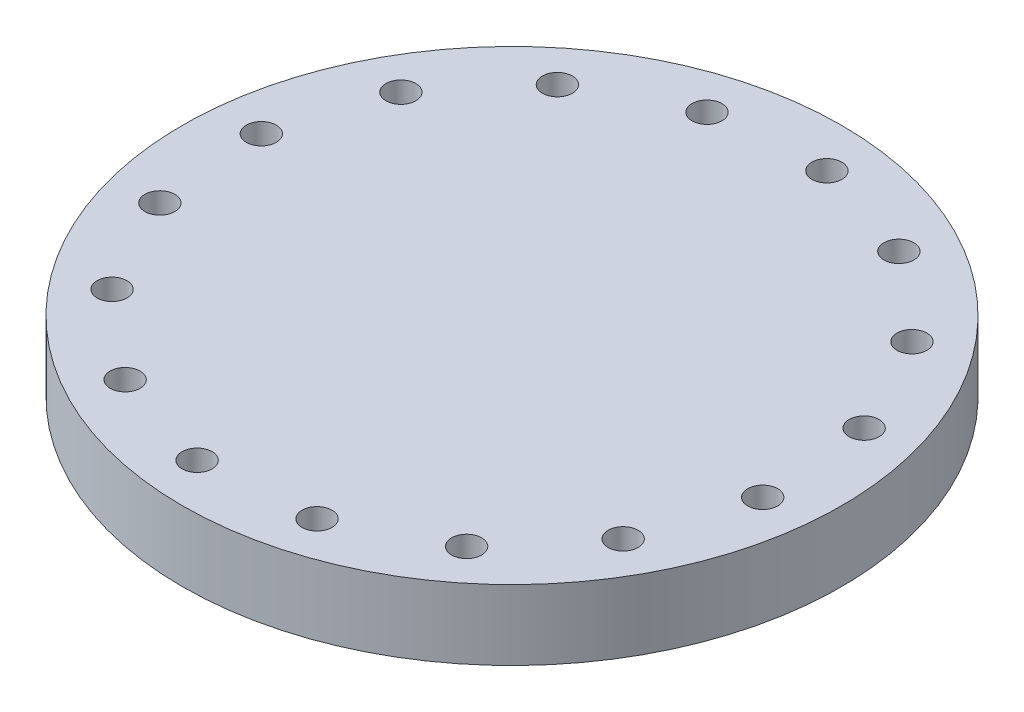
ISO-10303-21;
HEADER;
FILE_DESCRIPTION(('STEP AP214'),'2;1');
FILE_NAME('part.step','',(''),(''),'','','');
FILE_SCHEMA(('AUTOMOTIVE_DESIGN { 1 0 10303 214 1 1 1 1 }'));
ENDSEC;
DATA;
#1=APPLICATION_CONTEXT('core data for automotive mechanical design processes');
#2=APPLICATION_PROTOCOL_DEFINITION('international standard','automotive_design',2000,#1);
#3=PRODUCT_CONTEXT('',#1,'mechanical');
#4=PRODUCT('Part','Part','',(#3));
#5=PRODUCT_RELATED_PRODUCT_CATEGORY('part','',(#4));
#6=PRODUCT_DEFINITION_FORMATION('','',#4);
#7=PRODUCT_DEFINITION_CONTEXT('part definition',#1,'design');
#8=PRODUCT_DEFINITION('design','',#6,#7);
#9=PRODUCT_DEFINITION_SHAPE('','',#8);
#10=(LENGTH_UNIT() NAMED_UNIT(*) SI_UNIT(.MILLI.,.METRE.));
#11=(NAMED_UNIT(*) PLANE_ANGLE_UNIT() SI_UNIT($,.RADIAN.));
#12=(NAMED_UNIT(*) SI_UNIT($,.STERADIAN.) SOLID_ANGLE_UNIT());
#13=UNCERTAINTY_MEASURE_WITH_UNIT(LENGTH_MEASURE(1.E-05),#10,'distance_accuracy_value','');
#14=(GEOMETRIC_REPRESENTATION_CONTEXT(3) GLOBAL_UNCERTAINTY_ASSIGNED_CONTEXT((#13)) GLOBAL_UNIT_ASSIGNED_CONTEXT((#10,
#11,#12)) REPRESENTATION_CONTEXT('',''));
#15=CARTESIAN_POINT('',(0.,0.,0.));
#16=DIRECTION('',(0.,0.,1.));
#17=DIRECTION('',(1.,0.,0.));
#18=AXIS2_PLACEMENT_3D('',#15,#16,#17);
#19=CARTESIAN_POINT('',(0.,2.925,0.));
#20=DIRECTION('',(0.,-1.,0.));
#21=DIRECTION('',(0.,0.,-1.));
#22=AXIS2_PLACEMENT_3D('',#19,#20,#21);
#23=CYLINDRICAL_SURFACE('',#22,27.5);
#24=CARTESIAN_POINT('',(0.,2.925,0.));
#25=DIRECTION('',(0.,1.,0.));
#26=DIRECTION('',(0.,0.,1.));
#27=AXIS2_PLACEMENT_3D('',#24,#25,#26);
#28=CIRCLE('',#27,27.5);
#29=CARTESIAN_POINT('',(0.,2.925,27.5));
#30=VERTEX_POINT('',#29);
#31=EDGE_CURVE('E10',#30,#30,#28,.T.);
#32=ORIENTED_EDGE('',*,*,#31,.F.);
#33=EDGE_LOOP('',(#32));
#34=FACE_BOUND('',#33,.T.);
#35=CARTESIAN_POINT('',(0.,-2.925,0.));
#36=DIRECTION('',(0.,1.,0.));
#37=DIRECTION('',(0.,0.,1.));
#38=AXIS2_PLACEMENT_3D('',#35,#36,#37);
#39=CIRCLE('',#38,27.5);
#40=CARTESIAN_POINT('',(0.,-2.925,27.5));
#41=VERTEX_POINT('',#40);
#42=EDGE_CURVE('E40',#41,#41,#39,.T.);
#43=ORIENTED_EDGE('',*,*,#42,.T.);
#44=EDGE_LOOP('',(#43));
#45=FACE_BOUND('',#44,.T.);
#46=ADVANCED_FACE('F37',(#34,#45),#23,.T.);
#47=CARTESIAN_POINT('',(0.,2.925,0.));
#48=DIRECTION('',(0.,1.,0.));
#49=DIRECTION('',(0.,0.,1.));
#50=AXIS2_PLACEMENT_3D('',#47,#48,#49);
#51=PLANE('',#50);
#52=CARTESIAN_POINT('',(6.5570380805478,2.925,22.8269084987493));
#53=DIRECTION('',(0.,-1.,0.));
#54=DIRECTION('',(0.,0.,-1.));
#55=AXIS2_PLACEMENT_3D('',#52,#53,#54);
#56=CIRCLE('',#55,1.25);
#57=CARTESIAN_POINT('',(6.5570380805478,2.925,21.5769084987493));
#58=VERTEX_POINT('',#57);
#59=EDGE_CURVE('E62',#58,#58,#56,.T.);
#60=ORIENTED_EDGE('',*,*,#59,.T.);
#61=EDGE_LOOP('',(#60));
#62=FACE_BOUND('',#61,.T.);
#63=CARTESIAN_POINT('',(20.7775878842444,2.925,11.5045357017376));
#64=DIRECTION('',(0.,-1.,0.));
#65=DIRECTION('',(0.,0.,-1.));
#66=AXIS2_PLACEMENT_3D('',#63,#64,#65);
#67=CIRCLE('',#66,1.25);
#68=CARTESIAN_POINT('',(20.7775878842444,2.925,10.2545357017376));
#69=VERTEX_POINT('',#68);
#70=EDGE_CURVE('E55',#69,#69,#67,.T.);
#71=ORIENTED_EDGE('',*,*,#70,.T.);
#72=EDGE_LOOP('',(#71));
#73=FACE_BOUND('',#72,.T.);
#74=CARTESIAN_POINT('',(14.7933929711003,2.925,18.5800437136904));
#75=DIRECTION('',(0.,-1.,0.));
#76=DIRECTION('',(0.,0.,-1.));
#77=AXIS2_PLACEMENT_3D('',#74,#75,#76);
#78=CIRCLE('',#77,1.25);
#79=CARTESIAN_POINT('',(14.7933929711003,2.925,17.3300437136904));
#80=VERTEX_POINT('',#79);
#81=EDGE_CURVE('E69',#80,#80,#78,.T.);
#82=ORIENTED_EDGE('',*,*,#81,.T.);
#83=EDGE_LOOP('',(#82));
#84=FACE_BOUND('',#83,.T.);
#85=CARTESIAN_POINT('',(-2.67756641806983,2.925,23.5985833913147));
#86=DIRECTION('',(0.,-1.,0.));
#87=DIRECTION('',(0.,0.,-1.));
#88=AXIS2_PLACEMENT_3D('',#85,#86,#87);
#89=CIRCLE('',#88,1.25);
#90=CARTESIAN_POINT('',(-2.67756641806983,2.925,22.3485833913147));
#91=VERTEX_POINT('',#90);
#92=EDGE_CURVE('E68',#91,#91,#89,.T.);
#93=ORIENTED_EDGE('',*,*,#92,.T.);
#94=EDGE_LOOP('',(#93));
#95=FACE_BOUND('',#94,.T.);
#96=CARTESIAN_POINT('',(-11.5045357017362,2.925,20.7775878842435));
#97=DIRECTION('',(0.,-1.,0.));
#98=DIRECTION('',(0.,0.,-1.));
#99=AXIS2_PLACEMENT_3D('',#96,#97,#98);
#100=CIRCLE('',#99,1.24999999999997);
#101=CARTESIAN_POINT('',(-11.5045357017362,2.925,19.5275878842435));
#102=VERTEX_POINT('',#101);
#103=EDGE_CURVE('E79',#102,#102,#100,.T.);
#104=ORIENTED_EDGE('',*,*,#103,.T.);
#105=EDGE_LOOP('',(#104));
#106=FACE_BOUND('',#105,.T.);
#107=CARTESIAN_POINT('',(-18.5800437136888,2.925,14.7933929710995));
#108=DIRECTION('',(0.,-1.,0.));
#109=DIRECTION('',(0.,0.,-1.));
#110=AXIS2_PLACEMENT_3D('',#107,#108,#109);
#111=CIRCLE('',#110,1.25);
#112=CARTESIAN_POINT('',(-18.5800437136888,2.925,13.5433929710995));
#113=VERTEX_POINT('',#112);
#114=EDGE_CURVE('E85',#113,#113,#111,.T.);
#115=ORIENTED_EDGE('',*,*,#114,.T.);
#116=EDGE_LOOP('',(#115));
#117=FACE_BOUND('',#116,.T.);
#118=CARTESIAN_POINT('',(-22.8269084987479,2.925,6.5570380805468));
#119=DIRECTION('',(0.,-1.,0.));
#120=DIRECTION('',(0.,0.,-1.));
#121=AXIS2_PLACEMENT_3D('',#118,#119,#120);
#122=CIRCLE('',#121,1.25000000000003);
#123=CARTESIAN_POINT('',(-22.8269084987479,2.925,5.30703808054678));
#124=VERTEX_POINT('',#123);
#125=EDGE_CURVE('E91',#124,#124,#122,.T.);
#126=ORIENTED_EDGE('',*,*,#125,.T.);
#127=EDGE_LOOP('',(#126));
#128=FACE_BOUND('',#127,.T.);
#129=CARTESIAN_POINT('',(-23.5985833913132,2.925,-2.67756641807084));
#130=DIRECTION('',(0.,-1.,0.));
#131=DIRECTION('',(0.,0.,-1.));
#132=AXIS2_PLACEMENT_3D('',#129,#130,#131);
#133=CIRCLE('',#132,1.25);
#134=CARTESIAN_POINT('',(-23.5985833913132,2.925,-3.92756641807084));
#135=VERTEX_POINT('',#134);
#136=EDGE_CURVE('E97',#135,#135,#133,.T.);
#137=ORIENTED_EDGE('',*,*,#136,.T.);
#138=EDGE_LOOP('',(#137));
#139=FACE_BOUND('',#138,.T.);
#140=CARTESIAN_POINT('',(-20.777587884242,2.925,-11.5045357017372));
#141=DIRECTION('',(0.,-1.,0.));
#142=DIRECTION('',(0.,0.,-1.));
#143=AXIS2_PLACEMENT_3D('',#140,#141,#142);
#144=CIRCLE('',#143,1.25);
#145=CARTESIAN_POINT('',(-20.777587884242,2.925,-12.7545357017372));
#146=VERTEX_POINT('',#145);
#147=EDGE_CURVE('E103',#146,#146,#144,.T.);
#148=ORIENTED_EDGE('',*,*,#147,.T.);
#149=EDGE_LOOP('',(#148));
#150=FACE_BOUND('',#149,.T.);
#151=CARTESIAN_POINT('',(-14.7933929710979,2.925,-18.5800437136898));
#152=DIRECTION('',(0.,-1.,0.));
#153=DIRECTION('',(0.,0.,-1.));
#154=AXIS2_PLACEMENT_3D('',#151,#152,#153);
#155=CIRCLE('',#154,1.25);
#156=CARTESIAN_POINT('',(-14.7933929710979,2.925,-19.8300437136898));
#157=VERTEX_POINT('',#156);
#158=EDGE_CURVE('E109',#157,#157,#155,.T.);
#159=ORIENTED_EDGE('',*,*,#158,.T.);
#160=EDGE_LOOP('',(#159));
#161=FACE_BOUND('',#160,.T.);
#162=CARTESIAN_POINT('',(-6.5570380805456,2.925,-22.8269084987487));
#163=DIRECTION('',(0.,-1.,0.));
#164=DIRECTION('',(0.,0.,-1.));
#165=AXIS2_PLACEMENT_3D('',#162,#163,#164);
#166=CIRCLE('',#165,1.25);
#167=CARTESIAN_POINT('',(-6.5570380805456,2.925,-24.0769084987487));
#168=VERTEX_POINT('',#167);
#169=EDGE_CURVE('E115',#168,#168,#166,.T.);
#170=ORIENTED_EDGE('',*,*,#169,.T.);
#171=EDGE_LOOP('',(#170));
#172=FACE_BOUND('',#171,.T.);
#173=CARTESIAN_POINT('',(2.67756641807205,2.925,-23.5985833913141));
#174=DIRECTION('',(0.,-1.,0.));
#175=DIRECTION('',(0.,0.,-1.));
#176=AXIS2_PLACEMENT_3D('',#173,#174,#175);
#177=CIRCLE('',#176,1.25);
#178=CARTESIAN_POINT('',(2.67756641807205,2.925,-24.8485833913141));
#179=VERTEX_POINT('',#178);
#180=EDGE_CURVE('E121',#179,#179,#177,.T.);
#181=ORIENTED_EDGE('',*,*,#180,.T.);
#182=EDGE_LOOP('',(#181));
#183=FACE_BOUND('',#182,.T.);
#184=CARTESIAN_POINT('',(11.5045357017384,2.925,-20.777587884243));
#185=DIRECTION('',(0.,-1.,0.));
#186=DIRECTION('',(0.,0.,-1.));
#187=AXIS2_PLACEMENT_3D('',#184,#185,#186);
#188=CIRCLE('',#187,1.25);
#189=CARTESIAN_POINT('',(11.5045357017384,2.925,-22.027587884243));
#190=VERTEX_POINT('',#189);
#191=EDGE_CURVE('E127',#190,#190,#188,.T.);
#192=ORIENTED_EDGE('',*,*,#191,.T.);
#193=EDGE_LOOP('',(#192));
#194=FACE_BOUND('',#193,.T.);
#195=CARTESIAN_POINT('',(18.5800437136911,2.925,-14.7933929710991));
#196=DIRECTION('',(0.,-1.,0.));
#197=DIRECTION('',(0.,0.,-1.));
#198=AXIS2_PLACEMENT_3D('',#195,#196,#197);
#199=CIRCLE('',#198,1.25);
#200=CARTESIAN_POINT('',(18.5800437136911,2.925,-16.0433929710991));
#201=VERTEX_POINT('',#200);
#202=EDGE_CURVE('E133',#201,#201,#199,.T.);
#203=ORIENTED_EDGE('',*,*,#202,.T.);
#204=EDGE_LOOP('',(#203));
#205=FACE_BOUND('',#204,.T.);
#206=CARTESIAN_POINT('',(23.5985833913156,2.925,2.67756641807121));
#207=DIRECTION('',(0.,-1.,0.));
#208=DIRECTION('',(0.,0.,-1.));
#209=AXIS2_PLACEMENT_3D('',#206,#207,#208);
#210=CIRCLE('',#209,1.24999999999999);
#211=CARTESIAN_POINT('',(23.5985833913156,2.925,1.42756641807122));
#212=VERTEX_POINT('',#211);
#213=EDGE_CURVE('E139',#212,#212,#210,.T.);
#214=ORIENTED_EDGE('',*,*,#213,.T.);
#215=EDGE_LOOP('',(#214));
#216=FACE_BOUND('',#215,.T.);
#217=CARTESIAN_POINT('',(22.8269084987502,2.925,-6.55703808054647));
#218=DIRECTION('',(0.,-1.,0.));
#219=DIRECTION('',(0.,0.,-1.));
#220=AXIS2_PLACEMENT_3D('',#217,#218,#219);
#221=CIRCLE('',#220,1.25000000000003);
#222=CARTESIAN_POINT('',(22.8269084987502,2.925,-7.80703808054649));
#223=VERTEX_POINT('',#222);
#224=EDGE_CURVE('E47',#223,#223,#221,.T.);
#225=ORIENTED_EDGE('',*,*,#224,.T.);
#226=EDGE_LOOP('',(#225));
#227=FACE_BOUND('',#226,.T.);
#228=ORIENTED_EDGE('',*,*,#31,.T.);
#229=EDGE_LOOP('',(#228));
#230=FACE_BOUND('',#229,.T.);
#231=ADVANCED_FACE('F152',(#62,#73,#84,#95,#106,#117,#128,#139,#150,#161,#172,#183,#194,#205,
#216,#227,#230),#51,.T.);
#232=CARTESIAN_POINT('',(0.,-2.925,0.));
#233=DIRECTION('',(0.,1.,0.));
#234=DIRECTION('',(0.,0.,1.));
#235=AXIS2_PLACEMENT_3D('',#232,#233,#234);
#236=PLANE('',#235);
#237=CARTESIAN_POINT('',(6.5570380805478,-2.925,22.8269084987493));
#238=DIRECTION('',(0.,-1.,0.));
#239=DIRECTION('',(0.,0.,-1.));
#240=AXIS2_PLACEMENT_3D('',#237,#238,#239);
#241=CIRCLE('',#240,1.25);
#242=CARTESIAN_POINT('',(6.5570380805478,-2.925,21.5769084987493));
#243=VERTEX_POINT('',#242);
#244=EDGE_CURVE('E65',#243,#243,#241,.T.);
#245=ORIENTED_EDGE('',*,*,#244,.F.);
#246=EDGE_LOOP('',(#245));
#247=FACE_BOUND('',#246,.T.);
#248=CARTESIAN_POINT('',(20.7775878842444,-2.925,11.5045357017376));
#249=DIRECTION('',(0.,-1.,0.));
#250=DIRECTION('',(0.,0.,-1.));
#251=AXIS2_PLACEMENT_3D('',#248,#249,#250);
#252=CIRCLE('',#251,1.25);
#253=CARTESIAN_POINT('',(20.7775878842444,-2.925,10.2545357017376));
#254=VERTEX_POINT('',#253);
#255=EDGE_CURVE('E58',#254,#254,#252,.T.);
#256=ORIENTED_EDGE('',*,*,#255,.F.);
#257=EDGE_LOOP('',(#256));
#258=FACE_BOUND('',#257,.T.);
#259=CARTESIAN_POINT('',(14.7933929711003,-2.925,18.5800437136904));
#260=DIRECTION('',(0.,-1.,0.));
#261=DIRECTION('',(0.,0.,-1.));
#262=AXIS2_PLACEMENT_3D('',#259,#260,#261);
#263=CIRCLE('',#262,1.25);
#264=CARTESIAN_POINT('',(14.7933929711003,-2.925,17.3300437136904));
#265=VERTEX_POINT('',#264);
#266=EDGE_CURVE('E59',#265,#265,#263,.T.);
#267=ORIENTED_EDGE('',*,*,#266,.F.);
#268=EDGE_LOOP('',(#267));
#269=FACE_BOUND('',#268,.T.);
#270=CARTESIAN_POINT('',(-2.67756641806983,-2.925,23.5985833913147));
#271=DIRECTION('',(0.,-1.,0.));
#272=DIRECTION('',(0.,0.,-1.));
#273=AXIS2_PLACEMENT_3D('',#270,#271,#272);
#274=CIRCLE('',#273,1.25);
#275=CARTESIAN_POINT('',(-2.67756641806983,-2.925,22.3485833913147));
#276=VERTEX_POINT('',#275);
#277=EDGE_CURVE('E76',#276,#276,#274,.T.);
#278=ORIENTED_EDGE('',*,*,#277,.F.);
#279=EDGE_LOOP('',(#278));
#280=FACE_BOUND('',#279,.T.);
#281=CARTESIAN_POINT('',(-11.5045357017362,-2.925,20.7775878842435));
#282=DIRECTION('',(0.,-1.,0.));
#283=DIRECTION('',(0.,0.,-1.));
#284=AXIS2_PLACEMENT_3D('',#281,#282,#283);
#285=CIRCLE('',#284,1.24999999999997);
#286=CARTESIAN_POINT('',(-11.5045357017362,-2.925,19.5275878842435));
#287=VERTEX_POINT('',#286);
#288=EDGE_CURVE('E82',#287,#287,#285,.T.);
#289=ORIENTED_EDGE('',*,*,#288,.F.);
#290=EDGE_LOOP('',(#289));
#291=FACE_BOUND('',#290,.T.);
#292=CARTESIAN_POINT('',(-18.5800437136888,-2.925,14.7933929710995));
#293=DIRECTION('',(0.,-1.,0.));
#294=DIRECTION('',(0.,0.,-1.));
#295=AXIS2_PLACEMENT_3D('',#292,#293,#294);
#296=CIRCLE('',#295,1.25);
#297=CARTESIAN_POINT('',(-18.5800437136888,-2.925,13.5433929710995));
#298=VERTEX_POINT('',#297);
#299=EDGE_CURVE('E88',#298,#298,#296,.T.);
#300=ORIENTED_EDGE('',*,*,#299,.F.);
#301=EDGE_LOOP('',(#300));
#302=FACE_BOUND('',#301,.T.);
#303=CARTESIAN_POINT('',(-22.8269084987479,-2.925,6.5570380805468));
#304=DIRECTION('',(0.,-1.,0.));
#305=DIRECTION('',(0.,0.,-1.));
#306=AXIS2_PLACEMENT_3D('',#303,#304,#305);
#307=CIRCLE('',#306,1.25000000000003);
#308=CARTESIAN_POINT('',(-22.8269084987479,-2.925,5.30703808054678));
#309=VERTEX_POINT('',#308);
#310=EDGE_CURVE('E94',#309,#309,#307,.T.);
#311=ORIENTED_EDGE('',*,*,#310,.F.);
#312=EDGE_LOOP('',(#311));
#313=FACE_BOUND('',#312,.T.);
#314=CARTESIAN_POINT('',(-23.5985833913132,-2.925,-2.67756641807084));
#315=DIRECTION('',(0.,-1.,0.));
#316=DIRECTION('',(0.,0.,-1.));
#317=AXIS2_PLACEMENT_3D('',#314,#315,#316);
#318=CIRCLE('',#317,1.25);
#319=CARTESIAN_POINT('',(-23.5985833913132,-2.925,-3.92756641807084));
#320=VERTEX_POINT('',#319);
#321=EDGE_CURVE('E100',#320,#320,#318,.T.);
#322=ORIENTED_EDGE('',*,*,#321,.F.);
#323=EDGE_LOOP('',(#322));
#324=FACE_BOUND('',#323,.T.);
#325=CARTESIAN_POINT('',(-20.777587884242,-2.925,-11.5045357017372));
#326=DIRECTION('',(0.,-1.,0.));
#327=DIRECTION('',(0.,0.,-1.));
#328=AXIS2_PLACEMENT_3D('',#325,#326,#327);
#329=CIRCLE('',#328,1.25);
#330=CARTESIAN_POINT('',(-20.777587884242,-2.925,-12.7545357017372));
#331=VERTEX_POINT('',#330);
#332=EDGE_CURVE('E106',#331,#331,#329,.T.);
#333=ORIENTED_EDGE('',*,*,#332,.F.);
#334=EDGE_LOOP('',(#333));
#335=FACE_BOUND('',#334,.T.);
#336=CARTESIAN_POINT('',(-14.7933929710979,-2.925,-18.5800437136898));
#337=DIRECTION('',(0.,-1.,0.));
#338=DIRECTION('',(0.,0.,-1.));
#339=AXIS2_PLACEMENT_3D('',#336,#337,#338);
#340=CIRCLE('',#339,1.25);
#341=CARTESIAN_POINT('',(-14.7933929710979,-2.925,-19.8300437136898));
#342=VERTEX_POINT('',#341);
#343=EDGE_CURVE('E112',#342,#342,#340,.T.);
#344=ORIENTED_EDGE('',*,*,#343,.F.);
#345=EDGE_LOOP('',(#344));
#346=FACE_BOUND('',#345,.T.);
#347=CARTESIAN_POINT('',(-6.5570380805456,-2.925,-22.8269084987487));
#348=DIRECTION('',(0.,-1.,0.));
#349=DIRECTION('',(0.,0.,-1.));
#350=AXIS2_PLACEMENT_3D('',#347,#348,#349);
#351=CIRCLE('',#350,1.25);
#352=CARTESIAN_POINT('',(-6.5570380805456,-2.925,-24.0769084987487));
#353=VERTEX_POINT('',#352);
#354=EDGE_CURVE('E118',#353,#353,#351,.T.);
#355=ORIENTED_EDGE('',*,*,#354,.F.);
#356=EDGE_LOOP('',(#355));
#357=FACE_BOUND('',#356,.T.);
#358=CARTESIAN_POINT('',(2.67756641807205,-2.925,-23.5985833913141));
#359=DIRECTION('',(0.,-1.,0.));
#360=DIRECTION('',(0.,0.,-1.));
#361=AXIS2_PLACEMENT_3D('',#358,#359,#360);
#362=CIRCLE('',#361,1.25);
#363=CARTESIAN_POINT('',(2.67756641807205,-2.925,-24.8485833913141));
#364=VERTEX_POINT('',#363);
#365=EDGE_CURVE('E124',#364,#364,#362,.T.);
#366=ORIENTED_EDGE('',*,*,#365,.F.);
#367=EDGE_LOOP('',(#366));
#368=FACE_BOUND('',#367,.T.);
#369=CARTESIAN_POINT('',(11.5045357017384,-2.925,-20.777587884243));
#370=DIRECTION('',(0.,-1.,0.));
#371=DIRECTION('',(0.,0.,-1.));
#372=AXIS2_PLACEMENT_3D('',#369,#370,#371);
#373=CIRCLE('',#372,1.25);
#374=CARTESIAN_POINT('',(11.5045357017384,-2.925,-22.027587884243));
#375=VERTEX_POINT('',#374);
#376=EDGE_CURVE('E130',#375,#375,#373,.T.);
#377=ORIENTED_EDGE('',*,*,#376,.F.);
#378=EDGE_LOOP('',(#377));
#379=FACE_BOUND('',#378,.T.);
#380=CARTESIAN_POINT('',(18.5800437136911,-2.925,-14.7933929710991));
#381=DIRECTION('',(0.,-1.,0.));
#382=DIRECTION('',(0.,0.,-1.));
#383=AXIS2_PLACEMENT_3D('',#380,#381,#382);
#384=CIRCLE('',#383,1.25);
#385=CARTESIAN_POINT('',(18.5800437136911,-2.925,-16.0433929710991));
#386=VERTEX_POINT('',#385);
#387=EDGE_CURVE('E136',#386,#386,#384,.T.);
#388=ORIENTED_EDGE('',*,*,#387,.F.);
#389=EDGE_LOOP('',(#388));
#390=FACE_BOUND('',#389,.T.);
#391=CARTESIAN_POINT('',(23.5985833913156,-2.925,2.67756641807121));
#392=DIRECTION('',(0.,-1.,0.));
#393=DIRECTION('',(0.,0.,-1.));
#394=AXIS2_PLACEMENT_3D('',#391,#392,#393);
#395=CIRCLE('',#394,1.24999999999999);
#396=CARTESIAN_POINT('',(23.5985833913156,-2.925,1.42756641807122));
#397=VERTEX_POINT('',#396);
#398=EDGE_CURVE('E52',#397,#397,#395,.T.);
#399=ORIENTED_EDGE('',*,*,#398,.F.);
#400=EDGE_LOOP('',(#399));
#401=FACE_BOUND('',#400,.T.);
#402=CARTESIAN_POINT('',(22.8269084987502,-2.925,-6.55703808054647));
#403=DIRECTION('',(0.,-1.,0.));
#404=DIRECTION('',(0.,0.,-1.));
#405=AXIS2_PLACEMENT_3D('',#402,#403,#404);
#406=CIRCLE('',#405,1.25000000000003);
#407=CARTESIAN_POINT('',(22.8269084987502,-2.925,-7.80703808054649));
#408=VERTEX_POINT('',#407);
#409=EDGE_CURVE('E49',#408,#408,#406,.T.);
#410=ORIENTED_EDGE('',*,*,#409,.F.);
#411=EDGE_LOOP('',(#410));
#412=FACE_BOUND('',#411,.T.);
#413=ORIENTED_EDGE('',*,*,#42,.F.);
#414=EDGE_LOOP('',(#413));
#415=FACE_BOUND('',#414,.T.);
#416=ADVANCED_FACE('F148',(#247,#258,#269,#280,#291,#302,#313,#324,#335,#346,#357,#368,#379,
#390,#401,#412,#415),#236,.F.);
#417=CARTESIAN_POINT('',(22.8269084987502,2.925,-6.55703808054647));
#418=DIRECTION('',(0.,-1.,0.));
#419=DIRECTION('',(0.,0.,-1.));
#420=AXIS2_PLACEMENT_3D('',#417,#418,#419);
#421=CYLINDRICAL_SURFACE('',#420,1.25000000000003);
#422=ORIENTED_EDGE('',*,*,#409,.T.);
#423=EDGE_LOOP('',(#422));
#424=FACE_BOUND('',#423,.T.);
#425=ORIENTED_EDGE('',*,*,#224,.F.);
#426=EDGE_LOOP('',(#425));
#427=FACE_BOUND('',#426,.T.);
#428=ADVANCED_FACE('F151',(#424,#427),#421,.F.);
#429=CARTESIAN_POINT('',(23.5985833913156,2.925,2.67756641807121));
#430=DIRECTION('',(0.,-1.,0.));
#431=DIRECTION('',(0.,0.,-1.));
#432=AXIS2_PLACEMENT_3D('',#429,#430,#431);
#433=CYLINDRICAL_SURFACE('',#432,1.24999999999999);
#434=ORIENTED_EDGE('',*,*,#398,.T.);
#435=EDGE_LOOP('',(#434));
#436=FACE_BOUND('',#435,.T.);
#437=ORIENTED_EDGE('',*,*,#213,.F.);
#438=EDGE_LOOP('',(#437));
#439=FACE_BOUND('',#438,.T.);
#440=ADVANCED_FACE('F145',(#436,#439),#433,.F.);
#441=CARTESIAN_POINT('',(18.5800437136911,2.925,-14.7933929710991));
#442=DIRECTION('',(0.,-1.,0.));
#443=DIRECTION('',(0.,0.,-1.));
#444=AXIS2_PLACEMENT_3D('',#441,#442,#443);
#445=CYLINDRICAL_SURFACE('',#444,1.25);
#446=ORIENTED_EDGE('',*,*,#387,.T.);
#447=EDGE_LOOP('',(#446));
#448=FACE_BOUND('',#447,.T.);
#449=ORIENTED_EDGE('',*,*,#202,.F.);
#450=EDGE_LOOP('',(#449));
#451=FACE_BOUND('',#450,.T.);
#452=ADVANCED_FACE('F223',(#448,#451),#445,.F.);
#453=CARTESIAN_POINT('',(11.5045357017384,2.925,-20.777587884243));
#454=DIRECTION('',(0.,-1.,0.));
#455=DIRECTION('',(0.,0.,-1.));
#456=AXIS2_PLACEMENT_3D('',#453,#454,#455);
#457=CYLINDRICAL_SURFACE('',#456,1.25);
#458=ORIENTED_EDGE('',*,*,#376,.T.);
#459=EDGE_LOOP('',(#458));
#460=FACE_BOUND('',#459,.T.);
#461=ORIENTED_EDGE('',*,*,#191,.F.);
#462=EDGE_LOOP('',(#461));
#463=FACE_BOUND('',#462,.T.);
#464=ADVANCED_FACE('F219',(#460,#463),#457,.F.);
#465=CARTESIAN_POINT('',(2.67756641807205,2.925,-23.5985833913141));
#466=DIRECTION('',(0.,-1.,0.));
#467=DIRECTION('',(0.,0.,-1.));
#468=AXIS2_PLACEMENT_3D('',#465,#466,#467);
#469=CYLINDRICAL_SURFACE('',#468,1.25);
#470=ORIENTED_EDGE('',*,*,#365,.T.);
#471=EDGE_LOOP('',(#470));
#472=FACE_BOUND('',#471,.T.);
#473=ORIENTED_EDGE('',*,*,#180,.F.);
#474=EDGE_LOOP('',(#473));
#475=FACE_BOUND('',#474,.T.);
#476=ADVANCED_FACE('F215',(#472,#475),#469,.F.);
#477=CARTESIAN_POINT('',(-6.5570380805456,2.925,-22.8269084987487));
#478=DIRECTION('',(0.,-1.,0.));
#479=DIRECTION('',(0.,0.,-1.));
#480=AXIS2_PLACEMENT_3D('',#477,#478,#479);
#481=CYLINDRICAL_SURFACE('',#480,1.25);
#482=ORIENTED_EDGE('',*,*,#354,.T.);
#483=EDGE_LOOP('',(#482));
#484=FACE_BOUND('',#483,.T.);
#485=ORIENTED_EDGE('',*,*,#169,.F.);
#486=EDGE_LOOP('',(#485));
#487=FACE_BOUND('',#486,.T.);
#488=ADVANCED_FACE('F211',(#484,#487),#481,.F.);
#489=CARTESIAN_POINT('',(-14.7933929710979,2.925,-18.5800437136898));
#490=DIRECTION('',(0.,-1.,0.));
#491=DIRECTION('',(0.,0.,-1.));
#492=AXIS2_PLACEMENT_3D('',#489,#490,#491);
#493=CYLINDRICAL_SURFACE('',#492,1.25);
#494=ORIENTED_EDGE('',*,*,#343,.T.);
#495=EDGE_LOOP('',(#494));
#496=FACE_BOUND('',#495,.T.);
#497=ORIENTED_EDGE('',*,*,#158,.F.);
#498=EDGE_LOOP('',(#497));
#499=FACE_BOUND('',#498,.T.);
#500=ADVANCED_FACE('F207',(#496,#499),#493,.F.);
#501=CARTESIAN_POINT('',(-20.777587884242,2.925,-11.5045357017372));
#502=DIRECTION('',(0.,-1.,0.));
#503=DIRECTION('',(0.,0.,-1.));
#504=AXIS2_PLACEMENT_3D('',#501,#502,#503);
#505=CYLINDRICAL_SURFACE('',#504,1.25);
#506=ORIENTED_EDGE('',*,*,#332,.T.);
#507=EDGE_LOOP('',(#506));
#508=FACE_BOUND('',#507,.T.);
#509=ORIENTED_EDGE('',*,*,#147,.F.);
#510=EDGE_LOOP('',(#509));
#511=FACE_BOUND('',#510,.T.);
#512=ADVANCED_FACE('F203',(#508,#511),#505,.F.);
#513=CARTESIAN_POINT('',(-23.5985833913132,2.925,-2.67756641807084));
#514=DIRECTION('',(0.,-1.,0.));
#515=DIRECTION('',(0.,0.,-1.));
#516=AXIS2_PLACEMENT_3D('',#513,#514,#515);
#517=CYLINDRICAL_SURFACE('',#516,1.25);
#518=ORIENTED_EDGE('',*,*,#321,.T.);
#519=EDGE_LOOP('',(#518));
#520=FACE_BOUND('',#519,.T.);
#521=ORIENTED_EDGE('',*,*,#136,.F.);
#522=EDGE_LOOP('',(#521));
#523=FACE_BOUND('',#522,.T.);
#524=ADVANCED_FACE('F199',(#520,#523),#517,.F.);
#525=CARTESIAN_POINT('',(-22.8269084987479,2.925,6.5570380805468));
#526=DIRECTION('',(0.,-1.,0.));
#527=DIRECTION('',(0.,0.,-1.));
#528=AXIS2_PLACEMENT_3D('',#525,#526,#527);
#529=CYLINDRICAL_SURFACE('',#528,1.25000000000003);
#530=ORIENTED_EDGE('',*,*,#310,.T.);
#531=EDGE_LOOP('',(#530));
#532=FACE_BOUND('',#531,.T.);
#533=ORIENTED_EDGE('',*,*,#125,.F.);
#534=EDGE_LOOP('',(#533));
#535=FACE_BOUND('',#534,.T.);
#536=ADVANCED_FACE('F195',(#532,#535),#529,.F.);
#537=CARTESIAN_POINT('',(-18.5800437136888,2.925,14.7933929710995));
#538=DIRECTION('',(0.,-1.,0.));
#539=DIRECTION('',(0.,0.,-1.));
#540=AXIS2_PLACEMENT_3D('',#537,#538,#539);
#541=CYLINDRICAL_SURFACE('',#540,1.25);
#542=ORIENTED_EDGE('',*,*,#299,.T.);
#543=EDGE_LOOP('',(#542));
#544=FACE_BOUND('',#543,.T.);
#545=ORIENTED_EDGE('',*,*,#114,.F.);
#546=EDGE_LOOP('',(#545));
#547=FACE_BOUND('',#546,.T.);
#548=ADVANCED_FACE('F191',(#544,#547),#541,.F.);
#549=CARTESIAN_POINT('',(-11.5045357017362,2.925,20.7775878842435));
#550=DIRECTION('',(0.,-1.,0.));
#551=DIRECTION('',(0.,0.,-1.));
#552=AXIS2_PLACEMENT_3D('',#549,#550,#551);
#553=CYLINDRICAL_SURFACE('',#552,1.24999999999997);
#554=ORIENTED_EDGE('',*,*,#288,.T.);
#555=EDGE_LOOP('',(#554));
#556=FACE_BOUND('',#555,.T.);
#557=ORIENTED_EDGE('',*,*,#103,.F.);
#558=EDGE_LOOP('',(#557));
#559=FACE_BOUND('',#558,.T.);
#560=ADVANCED_FACE('F187',(#556,#559),#553,.F.);
#561=CARTESIAN_POINT('',(-2.67756641806983,2.925,23.5985833913147));
#562=DIRECTION('',(0.,-1.,0.));
#563=DIRECTION('',(0.,0.,-1.));
#564=AXIS2_PLACEMENT_3D('',#561,#562,#563);
#565=CYLINDRICAL_SURFACE('',#564,1.25);
#566=ORIENTED_EDGE('',*,*,#277,.T.);
#567=EDGE_LOOP('',(#566));
#568=FACE_BOUND('',#567,.T.);
#569=ORIENTED_EDGE('',*,*,#92,.F.);
#570=EDGE_LOOP('',(#569));
#571=FACE_BOUND('',#570,.T.);
#572=ADVANCED_FACE('F183',(#568,#571),#565,.F.);
#573=CARTESIAN_POINT('',(14.7933929711003,2.925,18.5800437136904));
#574=DIRECTION('',(0.,-1.,0.));
#575=DIRECTION('',(0.,0.,-1.));
#576=AXIS2_PLACEMENT_3D('',#573,#574,#575);
#577=CYLINDRICAL_SURFACE('',#576,1.25);
#578=ORIENTED_EDGE('',*,*,#266,.T.);
#579=EDGE_LOOP('',(#578));
#580=FACE_BOUND('',#579,.T.);
#581=ORIENTED_EDGE('',*,*,#81,.F.);
#582=EDGE_LOOP('',(#581));
#583=FACE_BOUND('',#582,.T.);
#584=ADVANCED_FACE('F176',(#580,#583),#577,.F.);
#585=CARTESIAN_POINT('',(20.7775878842444,2.925,11.5045357017376));
#586=DIRECTION('',(0.,-1.,0.));
#587=DIRECTION('',(0.,0.,-1.));
#588=AXIS2_PLACEMENT_3D('',#585,#586,#587);
#589=CYLINDRICAL_SURFACE('',#588,1.25);
#590=ORIENTED_EDGE('',*,*,#255,.T.);
#591=EDGE_LOOP('',(#590));
#592=FACE_BOUND('',#591,.T.);
#593=ORIENTED_EDGE('',*,*,#70,.F.);
#594=EDGE_LOOP('',(#593));
#595=FACE_BOUND('',#594,.T.);
#596=ADVANCED_FACE('F172',(#592,#595),#589,.F.);
#597=CARTESIAN_POINT('',(6.5570380805478,2.925,22.8269084987493));
#598=DIRECTION('',(0.,-1.,0.));
#599=DIRECTION('',(0.,0.,-1.));
#600=AXIS2_PLACEMENT_3D('',#597,#598,#599);
#601=CYLINDRICAL_SURFACE('',#600,1.25);
#602=ORIENTED_EDGE('',*,*,#244,.T.);
#603=EDGE_LOOP('',(#602));
#604=FACE_BOUND('',#603,.T.);
#605=ORIENTED_EDGE('',*,*,#59,.F.);
#606=EDGE_LOOP('',(#605));
#607=FACE_BOUND('',#606,.T.);
#608=ADVANCED_FACE('F175',(#604,#607),#601,.F.);
#609=CLOSED_SHELL('',(#46,#231,#416,#428,#440,#452,#464,#476,#488,#500,#512,#524,#536,#548,#560,
#572,#584,#596,#608));
#610=MANIFOLD_SOLID_BREP('B2',#609);
#611=ADVANCED_BREP_SHAPE_REPRESENTATION('',(#18,#610),#14);
#612=SHAPE_DEFINITION_REPRESENTATION(#9,#611);
ENDSEC;
END-ISO-10303-21;
